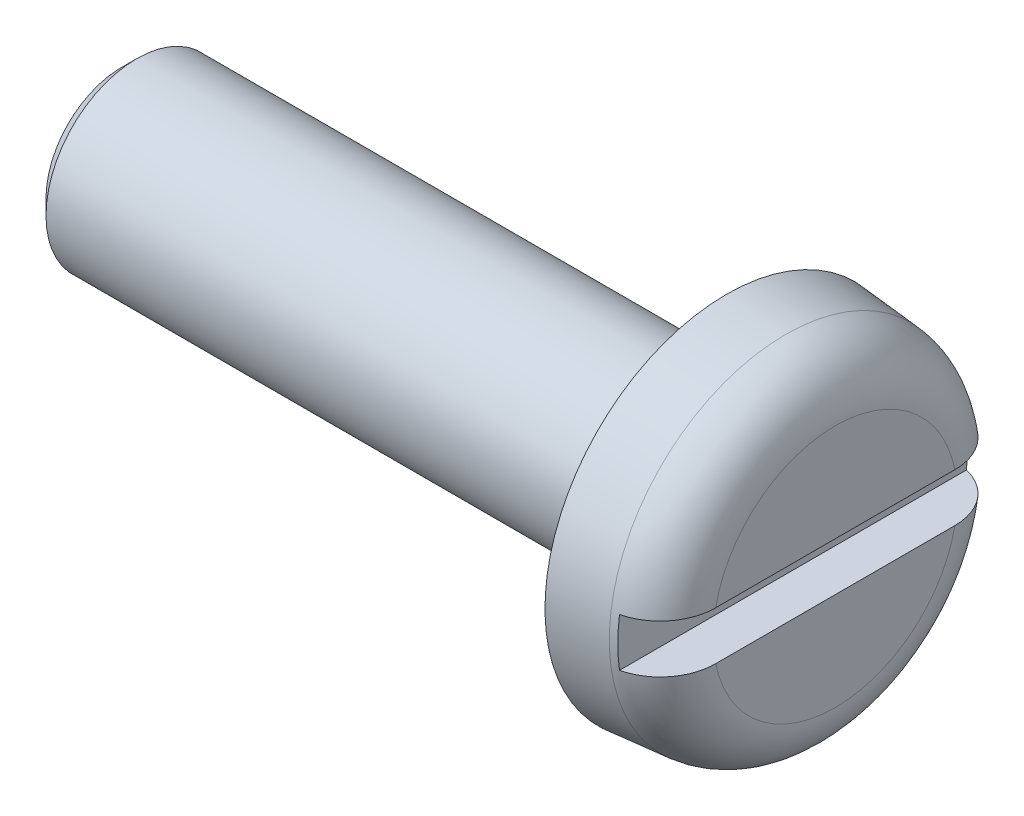
ISO-10303-21;
HEADER;
FILE_DESCRIPTION(('STEP AP214'),'2;1');
FILE_NAME('part.step','',(''),(''),'','','');
FILE_SCHEMA(('AUTOMOTIVE_DESIGN { 1 0 10303 214 1 1 1 1 }'));
ENDSEC;
DATA;
#1=APPLICATION_CONTEXT('core data for automotive mechanical design processes');
#2=APPLICATION_PROTOCOL_DEFINITION('international standard','automotive_design',2000,#1);
#3=PRODUCT_CONTEXT('',#1,'mechanical');
#4=PRODUCT('Part','Part','',(#3));
#5=PRODUCT_RELATED_PRODUCT_CATEGORY('part','',(#4));
#6=PRODUCT_DEFINITION_FORMATION('','',#4);
#7=PRODUCT_DEFINITION_CONTEXT('part definition',#1,'design');
#8=PRODUCT_DEFINITION('design','',#6,#7);
#9=PRODUCT_DEFINITION_SHAPE('','',#8);
#10=(LENGTH_UNIT() NAMED_UNIT(*) SI_UNIT(.MILLI.,.METRE.));
#11=(NAMED_UNIT(*) PLANE_ANGLE_UNIT() SI_UNIT($,.RADIAN.));
#12=(NAMED_UNIT(*) SI_UNIT($,.STERADIAN.) SOLID_ANGLE_UNIT());
#13=UNCERTAINTY_MEASURE_WITH_UNIT(LENGTH_MEASURE(1.E-05),#10,'distance_accuracy_value','');
#14=(GEOMETRIC_REPRESENTATION_CONTEXT(3) GLOBAL_UNCERTAINTY_ASSIGNED_CONTEXT((#13)) GLOBAL_UNIT_ASSIGNED_CONTEXT((#10,
#11,#12)) REPRESENTATION_CONTEXT('',''));
#15=CARTESIAN_POINT('',(0.,0.,0.));
#16=DIRECTION('',(0.,0.,1.));
#17=DIRECTION('',(1.,0.,0.));
#18=AXIS2_PLACEMENT_3D('',#15,#16,#17);
#19=CARTESIAN_POINT('',(0.,0.,0.));
#20=DIRECTION('',(1.,0.,0.));
#21=DIRECTION('',(0.,1.,0.));
#22=AXIS2_PLACEMENT_3D('',#19,#20,#21);
#23=PLANE('',#22);
#24=DIRECTION('',(0.,0.,1.));
#25=VECTOR('',#24,1.);
#26=CARTESIAN_POINT('',(0.,0.800000000000001,5.9464274989274));
#27=LINE('',#26,#25);
#28=CARTESIAN_POINT('',(0.,0.800000000000001,-3.9555566143216));
#29=VERTEX_POINT('',#28);
#30=CARTESIAN_POINT('',(0.,0.800000000000001,3.9555566143216));
#31=VERTEX_POINT('',#30);
#32=EDGE_CURVE('E89',#29,#31,#27,.T.);
#33=ORIENTED_EDGE('',*,*,#32,.F.);
#34=CARTESIAN_POINT('',(0.,0.,0.));
#35=DIRECTION('',(1.,0.,0.));
#36=DIRECTION('',(0.,1.,0.));
#37=AXIS2_PLACEMENT_3D('',#34,#35,#36);
#38=CIRCLE('',#37,4.03564469807531);
#39=EDGE_CURVE('E95',#29,#31,#38,.T.);
#40=ORIENTED_EDGE('',*,*,#39,.T.);
#41=EDGE_LOOP('',(#33,#40));
#42=FACE_BOUND('',#41,.T.);
#43=ADVANCED_FACE('F34',(#42),#23,.T.);
#44=DIRECTION('',(0.,0.,-1.));
#45=VECTOR('',#44,1.);
#46=CARTESIAN_POINT('',(0.,-0.799999999999999,5.9464274989274));
#47=LINE('',#46,#45);
#48=CARTESIAN_POINT('',(0.,-0.799999999999999,3.9555566143216));
#49=VERTEX_POINT('',#48);
#50=CARTESIAN_POINT('',(0.,-0.799999999999999,-3.9555566143216));
#51=VERTEX_POINT('',#50);
#52=EDGE_CURVE('E77',#49,#51,#47,.T.);
#53=ORIENTED_EDGE('',*,*,#52,.F.);
#54=EDGE_CURVE('E88',#49,#51,#38,.T.);
#55=ORIENTED_EDGE('',*,*,#54,.T.);
#56=EDGE_LOOP('',(#53,#55));
#57=FACE_BOUND('',#56,.T.);
#58=ADVANCED_FACE('F87',(#57),#23,.T.);
#59=CARTESIAN_POINT('',(-1.8,0.,0.));
#60=DIRECTION('',(1.,0.,0.));
#61=DIRECTION('',(0.,1.,0.));
#62=AXIS2_PLACEMENT_3D('',#59,#60,#61);
#63=TOROIDAL_SURFACE('',#62,4.03564469807531,1.8);
#64=CARTESIAN_POINT('',(-0.540762779772503,0.800000000000001,-5.2613759856627));
#65=CARTESIAN_POINT('',(-0.468002563632678,0.800000000000001,-5.18931554071322));
#66=CARTESIAN_POINT('',(-0.401331971706954,0.800000000000001,-5.11098969601856));
#67=CARTESIAN_POINT('',(-0.282092817877178,0.800000000000001,-4.94415021175995));
#68=CARTESIAN_POINT('',(-0.229543536062352,0.800000000000001,-4.85562287702027));
#69=CARTESIAN_POINT('',(-0.140058245351337,0.800000000000001,-4.67111833353568));
#70=CARTESIAN_POINT('',(-0.1031049986716,0.800000000000001,-4.57514948930957));
#71=CARTESIAN_POINT('',(-0.0456444426045708,0.800000000000001,-4.37844736615043));
#72=CARTESIAN_POINT('',(-0.0251330097273491,0.800000000000001,-4.27771528851783));
#73=CARTESIAN_POINT('',(-0.000807407176631883,0.800000000000001,-4.07306902098841));
#74=CARTESIAN_POINT('',(0.00280970089343096,0.800000000000001,-3.96913144304401));
#75=CARTESIAN_POINT('',(-0.00712688275186572,0.800000000000001,-3.76207815435695));
#76=CARTESIAN_POINT('',(-0.0206829358886565,0.800000000000001,-3.65896255860433));
#77=CARTESIAN_POINT('',(-0.0648595926784724,0.800000000000001,-3.45448287681273));
#78=CARTESIAN_POINT('',(-0.0957869506993019,0.800000000000001,-3.35318504696212));
#79=CARTESIAN_POINT('',(-0.173966954794268,0.800000000000001,-3.15709227715185));
#80=CARTESIAN_POINT('',(-0.221221562923288,0.800000000000001,-3.06229812038397));
#81=CARTESIAN_POINT('',(-0.331523815298362,0.800000000000001,-2.8805427251143));
#82=CARTESIAN_POINT('',(-0.394784707298972,0.800000000000001,-2.79371074818629));
#83=CARTESIAN_POINT('',(-0.535080660930293,0.800000000000001,-2.63196239249016));
#84=CARTESIAN_POINT('',(-0.612117058399805,0.800000000000001,-2.5570471706465));
#85=CARTESIAN_POINT('',(-0.777363260012997,0.800000000000001,-2.42207446625528));
#86=CARTESIAN_POINT('',(-0.865488934385646,0.800000000000001,-2.36191424206404));
#87=CARTESIAN_POINT('',(-1.05097305679666,0.800000000000001,-2.25807126721941));
#88=CARTESIAN_POINT('',(-1.1483280520288,0.800000000000001,-2.21438238463351));
#89=CARTESIAN_POINT('',(-1.34472607812469,0.800000000000001,-2.14709500481578));
#90=CARTESIAN_POINT('',(-1.44348146104708,0.800000000000001,-2.12265879049043));
#91=CARTESIAN_POINT('',(-1.64375523069054,0.800000000000001,-2.09184121198385));
#92=CARTESIAN_POINT('',(-1.74527230567127,0.800000000000001,-2.08545142227402));
#93=CARTESIAN_POINT('',(-1.94205144408969,0.800000000000001,-2.09089422506859));
#94=CARTESIAN_POINT('',(-2.03734311949205,0.800000000000001,-2.1017185632254));
#95=CARTESIAN_POINT('',(-2.22475371383136,0.800000000000001,-2.1391955846988));
#96=CARTESIAN_POINT('',(-2.31687240596036,0.800000000000001,-2.16584939704786));
#97=CARTESIAN_POINT('',(-2.49568716119116,0.800000000000001,-2.23389898004642));
#98=CARTESIAN_POINT('',(-2.5823713459202,0.800000000000001,-2.27532580427772));
#99=CARTESIAN_POINT('',(-2.74807422342881,0.800000000000001,-2.37138684264316));
#100=CARTESIAN_POINT('',(-2.82709115345045,0.800000000000001,-2.42602408391441));
#101=CARTESIAN_POINT('',(-2.9799165498153,0.800000000000001,-2.55022645282286));
#102=CARTESIAN_POINT('',(-3.05318434040937,0.800000000000001,-2.6204569537642));
#103=CARTESIAN_POINT('',(-3.18755425676067,0.800000000000001,-2.77172635941064));
#104=CARTESIAN_POINT('',(-3.24865355341293,0.800000000000001,-2.85276777029418));
#105=CARTESIAN_POINT('',(-3.35979277989752,0.800000000000001,-3.02754470544871));
#106=CARTESIAN_POINT('',(-3.40917690754713,0.800000000000001,-3.12169814746669));
#107=CARTESIAN_POINT('',(-3.49164209646366,0.800000000000001,-3.31689856469015));
#108=CARTESIAN_POINT('',(-3.52472176899937,0.800000000000001,-3.41794612626776));
#109=CARTESIAN_POINT('',(-3.57383047041871,0.800000000000001,-3.62528781310289));
#110=CARTESIAN_POINT('',(-3.58966846310995,0.800000000000001,-3.73162733467862));
#111=CARTESIAN_POINT('',(-3.60302482384296,0.800000000000001,-3.94545563862676));
#112=CARTESIAN_POINT('',(-3.60054405344453,0.800000000000001,-4.05294436671279));
#113=CARTESIAN_POINT('',(-3.57730809784689,0.800000000000001,-4.26456838674987));
#114=CARTESIAN_POINT('',(-3.5567824615156,0.800000000000001,-4.36872882792955));
#115=CARTESIAN_POINT('',(-3.49820144771329,0.800000000000001,-4.57200098520051));
#116=CARTESIAN_POINT('',(-3.46014775773205,0.800000000000001,-4.67111318628443));
#117=CARTESIAN_POINT('',(-3.36835841151673,0.800000000000001,-4.85952398282424));
#118=CARTESIAN_POINT('',(-3.31492535462002,0.800000000000001,-4.94897001417914));
#119=CARTESIAN_POINT('',(-3.19357222893311,0.800000000000001,-5.1174283983712));
#120=CARTESIAN_POINT('',(-3.12565341930971,0.800000000000001,-5.196441657106));
#121=CARTESIAN_POINT('',(-2.97843308341649,0.800000000000001,-5.34047951369632));
#122=CARTESIAN_POINT('',(-2.89932889793228,0.800000000000001,-5.40570586481735));
#123=CARTESIAN_POINT('',(-2.73119091898371,0.800000000000001,-5.52177624162289));
#124=CARTESIAN_POINT('',(-2.64215774589779,0.800000000000001,-5.57262116517992));
#125=CARTESIAN_POINT('',(-2.45774484574963,0.800000000000001,-5.65792437324546));
#126=CARTESIAN_POINT('',(-2.36244515719274,0.800000000000001,-5.69255575276872));
#127=CARTESIAN_POINT('',(-2.16736859982667,0.800000000000001,-5.7452167534151));
#128=CARTESIAN_POINT('',(-2.06759209093544,0.800000000000001,-5.76324770664509));
#129=CARTESIAN_POINT('',(-1.8670464863071,0.800000000000001,-5.78211504492871));
#130=CARTESIAN_POINT('',(-1.76628722683028,0.800000000000001,-5.78305617360559));
#131=CARTESIAN_POINT('',(-1.56601778316069,0.800000000000001,-5.76798048930461));
#132=CARTESIAN_POINT('',(-1.46650790933745,0.800000000000001,-5.75195954380567));
#133=CARTESIAN_POINT('',(-1.27169371218594,0.800000000000001,-5.70345798483568));
#134=CARTESIAN_POINT('',(-1.17638560748521,0.800000000000001,-5.67099251343592));
#135=CARTESIAN_POINT('',(-0.992639439872283,0.800000000000001,-5.59058259530451));
#136=CARTESIAN_POINT('',(-0.904192951568145,0.800000000000001,-5.54265751695209));
#137=CARTESIAN_POINT('',(-0.770167972453533,0.800000000000001,-5.45480755502994));
#138=CARTESIAN_POINT('',(-0.72159797671617,0.800000000000001,-5.41935523487936));
#139=CARTESIAN_POINT('',(-0.628240795352933,0.800000000000001,-5.34377955839393));
#140=CARTESIAN_POINT('',(-0.583453594173321,0.800000000000001,-5.30365622126655));
#141=CARTESIAN_POINT('',(-0.540762779772503,0.800000000000001,-5.2613759856627));
#142=B_SPLINE_CURVE_WITH_KNOTS('',3,(#64,#65,#66,#67,#68,#69,#70,#71,#72,#73,#74,#75,#76,#77,
#78,#79,#80,#81,#82,#83,#84,#85,#86,#87,#88,#89,#90,#91,#92,#93,#94,#95,#96,#97,#98,#99,#100,
#101,#102,#103,#104,#105,#106,#107,#108,#109,#110,#111,#112,#113,#114,#115,#116,#117,#118,#119,
#120,#121,#122,#123,#124,#125,#126,#127,#128,#129,#130,#131,#132,#133,#134,#135,#136,#137,#138,
#139,#140,#141),.UNSPECIFIED.,.T.,.F.,(4,2,2,2,2,2,2,2,2,2,2,2,2,2,2,2,2,2,2,2,2,2,2,2,2,2,2,2,
2,2,2,2,2,2,2,2,2,2,4),(0.,0.306991422181551,0.614399880160629,0.921467674223051,
1.22845843375204,1.53902124968411,1.84962677466023,2.1658978762407,2.48220699752465,
2.80297521633035,3.12377455756811,3.4422723020991,3.76065135929225,4.06426589424078,
4.36773865394976,4.65408102504908,4.94044382188495,5.22741215014114,5.51444629896418,
5.81757894484908,6.12078198527096,6.43825439592393,6.75575384260397,7.07673643314107,
7.39770392746607,7.71464653140136,8.0315586284897,8.34261788306675,8.65365010998578,
8.95975564746201,9.2658420696977,9.56858170023437,9.87129703520848,10.1721563958159,
10.4730890725641,10.7737451537516,11.0740260151275,11.254148730699,11.4342707056229),.UNSPECIFIED.);
#143=CARTESIAN_POINT('',(-1.4,0.800000000000001,-5.73510972270059));
#144=VERTEX_POINT('',#143);
#145=EDGE_CURVE('E127',#144,#29,#142,.T.);
#146=ORIENTED_EDGE('',*,*,#145,.F.);
#147=CARTESIAN_POINT('',(-1.4,0.,0.));
#148=DIRECTION('',(1.,0.,0.));
#149=DIRECTION('',(0.,1.,0.));
#150=AXIS2_PLACEMENT_3D('',#147,#148,#149);
#151=CIRCLE('',#150,5.79063757555374);
#152=CARTESIAN_POINT('',(-1.4,-0.8,-5.73510972270059));
#153=VERTEX_POINT('',#152);
#154=EDGE_CURVE('E98',#144,#153,#151,.F.);
#155=ORIENTED_EDGE('',*,*,#154,.T.);
#156=CARTESIAN_POINT('',(-0.540762779772502,-0.799999999999999,-5.2613759856627));
#157=CARTESIAN_POINT('',(-0.612348267833112,-0.799999999999999,-5.33226007170116));
#158=CARTESIAN_POINT('',(-0.689931624483256,-0.799999999999999,-5.3971854360864));
#159=CARTESIAN_POINT('',(-0.854947480958874,-0.799999999999999,-5.51316161419667));
#160=CARTESIAN_POINT('',(-0.942390684039739,-0.8,-5.56419714083425));
#161=CARTESIAN_POINT('',(-1.12461220777288,-0.8,-5.650821698781));
#162=CARTESIAN_POINT('',(-1.2193891749519,-0.8,-5.6864135722998));
#163=CARTESIAN_POINT('',(-1.41356630869313,-0.8,-5.74109194486802));
#164=CARTESIAN_POINT('',(-1.51296538612706,-0.8,-5.76018231167996));
#165=CARTESIAN_POINT('',(-1.71313899884107,-0.8,-5.78126121010733));
#166=CARTESIAN_POINT('',(-1.81390602781744,-0.8,-5.78332104849312));
#167=CARTESIAN_POINT('',(-2.01435310870812,-0.8,-5.77046455591491));
#168=CARTESIAN_POINT('',(-2.11403314136679,-0.8,-5.75554792471215));
#169=CARTESIAN_POINT('',(-2.309314019599,-0.8,-5.70921606698696));
#170=CARTESIAN_POINT('',(-2.40492104285082,-0.8,-5.67782686375404));
#171=CARTESIAN_POINT('',(-2.58952927366997,-0.8,-5.59948776999251));
#172=CARTESIAN_POINT('',(-2.67853045965259,-0.8,-5.55253782862158));
#173=CARTESIAN_POINT('',(-2.84769451709795,-0.8,-5.44428887284169));
#174=CARTESIAN_POINT('',(-2.92783091190503,-0.8,-5.38294849495739));
#175=CARTESIAN_POINT('',(-3.07676159380061,-0.8,-5.24777626794688));
#176=CARTESIAN_POINT('',(-3.1455556000378,-0.8,-5.17394410960072));
#177=CARTESIAN_POINT('',(-3.27042510006679,-0.8,-5.01531035004638));
#178=CARTESIAN_POINT('',(-3.32640120093555,-0.8,-4.93043053468211));
#179=CARTESIAN_POINT('',(-3.4235057335277,-0.8,-4.75256933107916));
#180=CARTESIAN_POINT('',(-3.46463341173424,-0.8,-4.65958753198411));
#181=CARTESIAN_POINT('',(-3.53144158740719,-0.8,-4.46694835930406));
#182=CARTESIAN_POINT('',(-3.55692557695194,-0.8,-4.36722286731019));
#183=CARTESIAN_POINT('',(-3.59108701240466,-0.8,-4.16493761370543));
#184=CARTESIAN_POINT('',(-3.59976314730697,-0.8,-4.06237763163826));
#185=CARTESIAN_POINT('',(-3.60023112204594,-0.8,-3.85550711797727));
#186=CARTESIAN_POINT('',(-3.59173848020812,-0.8,-3.75119596435576));
#187=CARTESIAN_POINT('',(-3.55768438775145,-0.8,-3.54539907321037));
#188=CARTESIAN_POINT('',(-3.53212117001275,-0.8,-3.44391362933273));
#189=CARTESIAN_POINT('',(-3.4641232265762,-0.8,-3.24471369522716));
#190=CARTESIAN_POINT('',(-3.42139292448942,-0.8,-3.14710004339202));
#191=CARTESIAN_POINT('',(-3.32030286126869,-0.8,-2.96031799684206));
#192=CARTESIAN_POINT('',(-3.26194098746564,-0.8,-2.87115074589868));
#193=CARTESIAN_POINT('',(-3.13053846590042,-0.8,-2.70303664476894));
#194=CARTESIAN_POINT('',(-3.05736818947569,-0.8,-2.62419095430027));
#195=CARTESIAN_POINT('',(-2.89859048019691,-0.8,-2.48017518003935));
#196=CARTESIAN_POINT('',(-2.81298317052277,-0.8,-2.41500496081701));
#197=CARTESIAN_POINT('',(-2.6334271917975,-0.8,-2.30187272884191));
#198=CARTESIAN_POINT('',(-2.53967929429022,-0.8,-2.25359299068592));
#199=CARTESIAN_POINT('',(-2.34507363608623,-0.8,-2.17455467657048));
#200=CARTESIAN_POINT('',(-2.24421969391145,-0.8,-2.14378676989656));
#201=CARTESIAN_POINT('',(-2.04443930043831,-0.8,-2.10254396085451));
#202=CARTESIAN_POINT('',(-1.94573097864464,-0.8,-2.09101175757253));
#203=CARTESIAN_POINT('',(-1.74783816921245,-0.8,-2.08550669067498));
#204=CARTESIAN_POINT('',(-1.64865381611907,-0.8,-2.09152912719204));
#205=CARTESIAN_POINT('',(-1.45702700128851,-0.8,-2.12018138669895));
#206=CARTESIAN_POINT('',(-1.36447664311325,-0.8,-2.14209986414969));
#207=CARTESIAN_POINT('',(-1.18420660887441,-0.8,-2.20075771988038));
#208=CARTESIAN_POINT('',(-1.09648771677086,-0.8,-2.23749949540336));
#209=CARTESIAN_POINT('',(-0.925723712262196,-0.8,-2.32557805989792));
#210=CARTESIAN_POINT('',(-0.842868129539057,-0.799999999999999,-2.37728131212897));
#211=CARTESIAN_POINT('',(-0.686362373553196,-0.799999999999999,-2.493116771694));
#212=CARTESIAN_POINT('',(-0.612714484293672,-0.799999999999999,-2.55725205281721));
#213=CARTESIAN_POINT('',(-0.472161131150061,-0.799999999999999,-2.70027682193658));
#214=CARTESIAN_POINT('',(-0.405916890621632,-0.799999999999999,-2.77981681647101));
#215=CARTESIAN_POINT('',(-0.287173334850297,-0.799999999999999,-2.9485732644704));
#216=CARTESIAN_POINT('',(-0.234676689699709,-0.799999999999999,-3.03779159293386));
#217=CARTESIAN_POINT('',(-0.143214450603963,-0.799999999999999,-3.22677844667971));
#218=CARTESIAN_POINT('',(-0.104782434188803,-0.799999999999999,-3.32680584966186));
#219=CARTESIAN_POINT('',(-0.0452446811445116,-0.799999999999999,-3.5318922427284));
#220=CARTESIAN_POINT('',(-0.0241387825809872,-0.799999999999999,-3.63695118577701));
#221=CARTESIAN_POINT('',(1.12670491668143E-05,-0.799999999999999,-3.84916824961405));
#222=CARTESIAN_POINT('',(0.00304965106473683,-0.799999999999999,-3.95632702970971));
#223=CARTESIAN_POINT('',(-0.00921984656727694,-0.799999999999999,-4.1696231990436));
#224=CARTESIAN_POINT('',(-0.0245310191193001,-0.799999999999999,-4.27576040162512));
#225=CARTESIAN_POINT('',(-0.0728327354457022,-0.799999999999999,-4.48216521024852));
#226=CARTESIAN_POINT('',(-0.105541716926033,-0.799999999999999,-4.58249883820926));
#227=CARTESIAN_POINT('',(-0.187634706209927,-0.799999999999999,-4.77599767564169));
#228=CARTESIAN_POINT('',(-0.236996530319204,-0.799999999999999,-4.86917222023919));
#229=CARTESIAN_POINT('',(-0.329466421611779,-0.799999999999999,-5.01228034019194));
#230=CARTESIAN_POINT('',(-0.367921794022496,-0.799999999999999,-5.06527765273015));
#231=CARTESIAN_POINT('',(-0.450329512489137,-0.799999999999999,-5.16681267030748));
#232=CARTESIAN_POINT('',(-0.494281795276484,-0.799999999999999,-5.21535042666423));
#233=CARTESIAN_POINT('',(-0.540762779772502,-0.799999999999999,-5.2613759856627));
#234=B_SPLINE_CURVE_WITH_KNOTS('',3,(#156,#157,#158,#159,#160,#161,#162,#163,#164,#165,#166,
#167,#168,#169,#170,#171,#172,#173,#174,#175,#176,#177,#178,#179,#180,#181,#182,#183,#184,#185,
#186,#187,#188,#189,#190,#191,#192,#193,#194,#195,#196,#197,#198,#199,#200,#201,#202,#203,#204,
#205,#206,#207,#208,#209,#210,#211,#212,#213,#214,#215,#216,#217,#218,#219,#220,#221,#222,#223,
#224,#225,#226,#227,#228,#229,#230,#231,#232,#233),.UNSPECIFIED.,.T.,.F.,(4,2,2,2,2,2,2,2,2,2,2,
2,2,2,2,2,2,2,2,2,2,2,2,2,2,2,2,2,2,2,2,2,2,2,2,2,2,2,4),(0.,0.301990665553572,
0.604312368689127,0.906578409704399,1.20877358382585,1.50970282356458,1.81063738549513,
2.11109795731507,2.41155951085344,2.71289551957028,3.01423898861248,3.31784547930252,
3.6214673750267,3.92882908454075,4.23621476717483,4.54873547778502,4.86128854507609,
5.17947093252907,5.49769634531691,5.81883829248559,6.13997705919035,6.45470120134885,
6.76925749373849,7.06587349636817,7.36241009390429,7.64643650558142,7.93050886880334,
8.22223277783168,8.51402890710833,8.8231740529347,9.13237919724671,9.45232886972293,
9.77227555183242,10.0923243536798,10.4124305633264,10.7275071903339,11.042165741933,
11.2382527614178,11.4343375241794),.UNSPECIFIED.);
#235=EDGE_CURVE('E57',#51,#153,#234,.T.);
#236=ORIENTED_EDGE('',*,*,#235,.F.);
#237=ORIENTED_EDGE('',*,*,#54,.F.);
#238=CARTESIAN_POINT('',(-0.836266142673704,-0.799999999999999,2.38476753441919));
#239=CARTESIAN_POINT('',(-0.917616920395549,-0.799999999999999,2.33037611985148));
#240=CARTESIAN_POINT('',(-1.00338812809191,-0.8,2.28250940898636));
#241=CARTESIAN_POINT('',(-1.18171371257086,-0.8,2.20157945647336));
#242=CARTESIAN_POINT('',(-1.27427138419532,-0.8,2.16852346158101));
#243=CARTESIAN_POINT('',(-1.46387360375784,-0.8,2.11861651463578));
#244=CARTESIAN_POINT('',(-1.56092620726988,-0.8,2.10179593736475));
#245=CARTESIAN_POINT('',(-1.75645828986596,-0.8,2.08531619913094));
#246=CARTESIAN_POINT('',(-1.85493729786073,-0.8,2.08565149582934));
#247=CARTESIAN_POINT('',(-2.04724581885373,-0.8,2.10316628821439));
#248=CARTESIAN_POINT('',(-2.1411242466631,-0.8,2.11981673272017));
#249=CARTESIAN_POINT('',(-2.32483197664105,-0.8,2.16840533825103));
#250=CARTESIAN_POINT('',(-2.41466058319104,-0.8,2.20034611475993));
#251=CARTESIAN_POINT('',(-2.58937479658255,-0.8,2.27883470838468));
#252=CARTESIAN_POINT('',(-2.67416016608233,-0.8,2.32560484151197));
#253=CARTESIAN_POINT('',(-2.83527159661578,-0.8,2.43194790875205));
#254=CARTESIAN_POINT('',(-2.91159566808817,-0.8,2.4915238443409));
#255=CARTESIAN_POINT('',(-3.05833847206813,-0.8,2.62557742394097));
#256=CARTESIAN_POINT('',(-3.12814463920814,-0.8,2.70072607421442));
#257=CARTESIAN_POINT('',(-3.25476371599267,-0.8,2.86127427469928));
#258=CARTESIAN_POINT('',(-3.31157384747778,-0.8,2.94667601077194));
#259=CARTESIAN_POINT('',(-3.41282909605205,-0.8,3.12914373500798));
#260=CARTESIAN_POINT('',(-3.4566732787476,-0.8,3.22654397769993));
#261=CARTESIAN_POINT('',(-3.52749042959911,-0.8,3.42730182448779));
#262=CARTESIAN_POINT('',(-3.55446245509905,-0.8,3.53065976109082));
#263=CARTESIAN_POINT('',(-3.59074777581197,-0.8,3.74099682308468));
#264=CARTESIAN_POINT('',(-3.59996828480699,-0.8,3.84799201669904));
#265=CARTESIAN_POINT('',(-3.60003154521387,-0.8,4.06199242805616));
#266=CARTESIAN_POINT('',(-3.59087543963191,-0.8,4.16899764476154));
#267=CARTESIAN_POINT('',(-3.5545508836994,-0.8,4.37828946953499));
#268=CARTESIAN_POINT('',(-3.5276490501339,-0.8,4.48062230606524));
#269=CARTESIAN_POINT('',(-3.45672417667962,-0.8,4.67917518429467));
#270=CARTESIAN_POINT('',(-3.41270279239386,-0.8,4.77539581604843));
#271=CARTESIAN_POINT('',(-3.30967441571423,-0.8,4.95711293936014));
#272=CARTESIAN_POINT('',(-3.2509575917222,-0.8,5.04277397494753));
#273=CARTESIAN_POINT('',(-3.11977209379603,-0.8,5.20282644762344));
#274=CARTESIAN_POINT('',(-3.04730458946901,-0.8,5.27721884223437));
#275=CARTESIAN_POINT('',(-2.89186263836087,-0.8,5.41145672931944));
#276=CARTESIAN_POINT('',(-2.80906226498413,-0.8,5.47150384635816));
#277=CARTESIAN_POINT('',(-2.63447307414862,-0.8,5.57667826647956));
#278=CARTESIAN_POINT('',(-2.54268479385402,-0.8,5.62180646049025));
#279=CARTESIAN_POINT('',(-2.35372245855627,-0.8,5.69541178601739));
#280=CARTESIAN_POINT('',(-2.25661170214885,-0.8,5.72405148642268));
#281=CARTESIAN_POINT('',(-2.05894963569563,-0.8,5.76452632903134));
#282=CARTESIAN_POINT('',(-1.95839844559039,-0.8,5.77636205644549));
#283=CARTESIAN_POINT('',(-1.75726466993558,-0.8,5.78286013265482));
#284=CARTESIAN_POINT('',(-1.65668492734368,-0.8,5.77761084028505));
#285=CARTESIAN_POINT('',(-1.45783846372769,-0.8,5.75028865632157));
#286=CARTESIAN_POINT('',(-1.35957171560434,-0.8,5.72821596193375));
#287=CARTESIAN_POINT('',(-1.16819371267695,-0.8,5.66791633540255));
#288=CARTESIAN_POINT('',(-1.07507939389964,-0.8,5.62969912319174));
#289=CARTESIAN_POINT('',(-0.896555358732773,-0.8,5.53823241598758));
#290=CARTESIAN_POINT('',(-0.811145708608114,-0.799999999999999,5.48498279172249));
#291=CARTESIAN_POINT('',(-0.650082876219721,-0.799999999999999,5.36476593037792));
#292=CARTESIAN_POINT('',(-0.574468804826388,-0.799999999999999,5.29774630893073));
#293=CARTESIAN_POINT('',(-0.435451535945253,-0.799999999999999,5.15205983914348));
#294=CARTESIAN_POINT('',(-0.372048731656855,-0.799999999999999,5.07339261589811));
#295=CARTESIAN_POINT('',(-0.258650816330334,-0.799999999999999,4.90594446263168));
#296=CARTESIAN_POINT('',(-0.208774635933076,-0.799999999999999,4.8170830169983));
#297=CARTESIAN_POINT('',(-0.124428147888648,-0.799999999999999,4.63233098726459));
#298=CARTESIAN_POINT('',(-0.0899587510920711,-0.799999999999999,4.53643998796633));
#299=CARTESIAN_POINT('',(-0.0368868820421763,-0.799999999999999,4.33899079972006));
#300=CARTESIAN_POINT('',(-0.0185025255877259,-0.799999999999999,4.23737401613092));
#301=CARTESIAN_POINT('',(0.0012573479908821,-0.799999999999999,4.03250747712129));
#302=CARTESIAN_POINT('',(0.00263209949744791,-0.799999999999999,3.9292576484054));
#303=CARTESIAN_POINT('',(-0.0116307665412087,-0.799999999999999,3.72214563494947));
#304=CARTESIAN_POINT('',(-0.0275632061751758,-0.799999999999999,3.61830377486543));
#305=CARTESIAN_POINT('',(-0.076333596788761,-0.799999999999999,3.41464106293113));
#306=CARTESIAN_POINT('',(-0.109177249679509,-0.799999999999999,3.31482157954313));
#307=CARTESIAN_POINT('',(-0.191511099721981,-0.799999999999999,3.12021092040486));
#308=CARTESIAN_POINT('',(-0.241286347194323,-0.799999999999999,3.02554040328379));
#309=CARTESIAN_POINT('',(-0.355915618814842,-0.799999999999999,2.8458978279608));
#310=CARTESIAN_POINT('',(-0.420755571218364,-0.799999999999999,2.76091682866338));
#311=CARTESIAN_POINT('',(-0.543269993526276,-0.799999999999999,2.62572980615078));
#312=CARTESIAN_POINT('',(-0.597683333164854,-0.799999999999999,2.57253239665292));
#313=CARTESIAN_POINT('',(-0.712598229155983,-0.799999999999999,2.4731680246369));
#314=CARTESIAN_POINT('',(-0.773099631725334,-0.799999999999999,2.4270008846096));
#315=CARTESIAN_POINT('',(-0.836266142673704,-0.799999999999999,2.38476753441919));
#316=B_SPLINE_CURVE_WITH_KNOTS('',3,(#238,#239,#240,#241,#242,#243,#244,#245,#246,#247,#248,
#249,#250,#251,#252,#253,#254,#255,#256,#257,#258,#259,#260,#261,#262,#263,#264,#265,#266,#267,
#268,#269,#270,#271,#272,#273,#274,#275,#276,#277,#278,#279,#280,#281,#282,#283,#284,#285,#286,
#287,#288,#289,#290,#291,#292,#293,#294,#295,#296,#297,#298,#299,#300,#301,#302,#303,#304,#305,
#306,#307,#308,#309,#310,#311,#312,#313,#314,#315),.UNSPECIFIED.,.T.,.F.,(4,2,2,2,2,2,2,2,2,2,2,
2,2,2,2,2,2,2,2,2,2,2,2,2,2,2,2,2,2,2,2,2,2,2,2,2,2,2,4),(0.,0.293321979457734,
0.586787322516146,0.880800650631159,1.17471899604829,1.45941156882231,1.74415285702185,
2.03338255615662,2.32268012018922,2.62901646924018,2.93541824267213,3.25435495988079,
3.57330949465531,3.89392670887913,4.21452398166584,4.53041098625831,4.84626744954257,
5.15632110717719,5.46634840404057,5.77172128030291,6.07707591701729,6.37936593322563,
6.6816454217023,6.98236409614661,7.2830792455858,7.5836136045785,7.88415054810524,
8.18585270916065,8.48756458331813,8.79184901385485,9.09615143133901,9.40451898940015,
9.71290042731147,10.0266186112637,10.3404426401165,10.6598354635326,10.9789311372724,
11.2066928680963,11.43444884715),.UNSPECIFIED.);
#317=CARTESIAN_POINT('',(-1.4,-0.8,5.73510972270059));
#318=VERTEX_POINT('',#317);
#319=EDGE_CURVE('E74',#318,#49,#316,.T.);
#320=ORIENTED_EDGE('',*,*,#319,.F.);
#321=CARTESIAN_POINT('',(-1.4,0.800000000000001,5.73510972270059));
#322=VERTEX_POINT('',#321);
#323=EDGE_CURVE('E83',#318,#322,#151,.F.);
#324=ORIENTED_EDGE('',*,*,#323,.T.);
#325=CARTESIAN_POINT('',(-0.836266142673704,0.800000000000001,2.38476753441919));
#326=CARTESIAN_POINT('',(-0.748506893430262,0.800000000000001,2.44345191414655));
#327=CARTESIAN_POINT('',(-0.665766647879348,0.800000000000001,2.50981960320106));
#328=CARTESIAN_POINT('',(-0.51255125636554,0.800000000000001,2.65561376218173));
#329=CARTESIAN_POINT('',(-0.442099246823711,0.800000000000001,2.73506432962604));
#330=CARTESIAN_POINT('',(-0.315475262434064,0.800000000000001,2.90443495121528));
#331=CARTESIAN_POINT('',(-0.259280268430428,0.800000000000001,2.99433778254075));
#332=CARTESIAN_POINT('',(-0.162548938959551,0.800000000000001,3.18215299216268));
#333=CARTESIAN_POINT('',(-0.122006089879258,0.800000000000001,3.28006201809487));
#334=CARTESIAN_POINT('',(-0.0572425021539002,0.800000000000001,3.4827212450359));
#335=CARTESIAN_POINT('',(-0.0332676369124976,0.800000000000001,3.58755021276299));
#336=CARTESIAN_POINT('',(-0.00342578696207457,0.800000000000001,3.79976969875038));
#337=CARTESIAN_POINT('',(0.00244009682357935,0.800000000000001,3.90716037234792));
#338=CARTESIAN_POINT('',(-0.00425089062541499,0.800000000000001,4.12040369131769));
#339=CARTESIAN_POINT('',(-0.0166422393499393,0.800000000000001,4.22626147612868));
#340=CARTESIAN_POINT('',(-0.0593599277228405,0.800000000000001,4.43429705562788));
#341=CARTESIAN_POINT('',(-0.0896844898843736,0.800000000000001,4.53647521396505));
#342=CARTESIAN_POINT('',(-0.166811113143519,0.800000000000001,4.73226366726685));
#343=CARTESIAN_POINT('',(-0.21330327024463,0.800000000000001,4.82599604324917));
#344=CARTESIAN_POINT('',(-0.32162267572296,0.800000000000001,5.00413844404781));
#345=CARTESIAN_POINT('',(-0.383448471720296,0.800000000000001,5.08854935068632));
#346=CARTESIAN_POINT('',(-0.519544306999232,0.800000000000001,5.24416143149033));
#347=CARTESIAN_POINT('',(-0.593588166123753,0.800000000000001,5.31556046719266));
#348=CARTESIAN_POINT('',(-0.75273955583597,0.800000000000001,5.44472836027191));
#349=CARTESIAN_POINT('',(-0.837846323514924,0.800000000000001,5.5024981567616));
#350=CARTESIAN_POINT('',(-1.01558854842572,0.800000000000001,5.60205300956143));
#351=CARTESIAN_POINT('',(-1.10812041731753,0.8,5.64402306987624));
#352=CARTESIAN_POINT('',(-1.29895009056469,0.8,5.71170590778668));
#353=CARTESIAN_POINT('',(-1.39724763350181,0.8,5.7374194218397));
#354=CARTESIAN_POINT('',(-1.59606633976361,0.8,5.77169733961628));
#355=CARTESIAN_POINT('',(-1.69656671478609,0.8,5.78038241634162));
#356=CARTESIAN_POINT('',(-1.89759433538528,0.8,5.78071120137491));
#357=CARTESIAN_POINT('',(-1.99812158035831,0.8,5.77235526485593));
#358=CARTESIAN_POINT('',(-2.19609344292374,0.8,5.73889133318644));
#359=CARTESIAN_POINT('',(-2.29354498303738,0.8,5.71382425898093));
#360=CARTESIAN_POINT('',(-2.48286854703151,0.8,5.64771711956062));
#361=CARTESIAN_POINT('',(-2.57474056774009,0.8,5.60667704526538));
#362=CARTESIAN_POINT('',(-2.75051258087327,0.8,5.50972539102507));
#363=CARTESIAN_POINT('',(-2.8343959465404,0.8,5.45378367661804));
#364=CARTESIAN_POINT('',(-2.99165678299636,0.8,5.32869697027017));
#365=CARTESIAN_POINT('',(-3.06503402042885,0.8,5.25955168513844));
#366=CARTESIAN_POINT('',(-3.19973989676036,0.8,5.10955333442706));
#367=CARTESIAN_POINT('',(-3.26098586193471,0.8,5.02862604540654));
#368=CARTESIAN_POINT('',(-3.36919753390679,0.8,4.85773374858047));
#369=CARTESIAN_POINT('',(-3.41616259992529,0.8,4.76776833547817));
#370=CARTESIAN_POINT('',(-3.49507738631938,0.8,4.5802716594319));
#371=CARTESIAN_POINT('',(-3.52685014697164,0.8,4.48266594703615));
#372=CARTESIAN_POINT('',(-3.57383908213109,0.8,4.28355151356638));
#373=CARTESIAN_POINT('',(-3.58905405146405,0.8,4.18204250894425));
#374=CARTESIAN_POINT('',(-3.60277332841501,0.8,3.97627512738235));
#375=CARTESIAN_POINT('',(-3.60100695654502,0.8,3.87199872990389));
#376=CARTESIAN_POINT('',(-3.58032198396241,0.8,3.66516328359259));
#377=CARTESIAN_POINT('',(-3.56140169370222,0.8,3.56260440493742));
#378=CARTESIAN_POINT('',(-3.50655445326333,0.8,3.3601262182977));
#379=CARTESIAN_POINT('',(-3.47032341934756,0.8,3.26028924640596));
#380=CARTESIAN_POINT('',(-3.38182060870726,0.8,3.06798854276054));
#381=CARTESIAN_POINT('',(-3.32954675396352,0.8,2.97552576813911));
#382=CARTESIAN_POINT('',(-3.20964725567174,0.8,2.79948120171889));
#383=CARTESIAN_POINT('',(-3.14184223712501,0.800000000000001,2.71602141217628));
#384=CARTESIAN_POINT('',(-2.99302219632622,0.800000000000001,2.56181483592421));
#385=CARTESIAN_POINT('',(-2.91200632330115,0.800000000000001,2.49106886859632));
#386=CARTESIAN_POINT('',(-2.73997760711788,0.800000000000001,2.36551639760888));
#387=CARTESIAN_POINT('',(-2.64910309983349,0.800000000000001,2.31052086250488));
#388=CARTESIAN_POINT('',(-2.4590409075158,0.800000000000001,2.21753014012797));
#389=CARTESIAN_POINT('',(-2.35985743984191,0.800000000000001,2.17952638970964));
#390=CARTESIAN_POINT('',(-2.16147923078881,0.800000000000001,2.12383562208936));
#391=CARTESIAN_POINT('',(-2.06255196747457,0.800000000000001,2.10519696055357));
#392=CARTESIAN_POINT('',(-1.86294330184555,0.800000000000001,2.08580594361597));
#393=CARTESIAN_POINT('',(-1.76226208748034,0.800000000000001,2.08505168341593));
#394=CARTESIAN_POINT('',(-1.56749167167987,0.800000000000001,2.1010369991765));
#395=CARTESIAN_POINT('',(-1.47332742294699,0.800000000000001,2.11688981083895));
#396=CARTESIAN_POINT('',(-1.28901868791397,0.800000000000001,2.16397488361137));
#397=CARTESIAN_POINT('',(-1.19886974388066,0.800000000000001,2.19518960135132));
#398=CARTESIAN_POINT('',(-1.0638315376683,0.800000000000001,2.25452352584505));
#399=CARTESIAN_POINT('',(-1.01673933731484,0.800000000000001,2.27777851827376));
#400=CARTESIAN_POINT('',(-0.924773358306768,0.800000000000001,2.32831196324339));
#401=CARTESIAN_POINT('',(-0.879899400191996,0.800000000000001,2.35559008959122));
#402=CARTESIAN_POINT('',(-0.836266142673704,0.800000000000001,2.38476753441919));
#403=B_SPLINE_CURVE_WITH_KNOTS('',3,(#325,#326,#327,#328,#329,#330,#331,#332,#333,#334,#335,
#336,#337,#338,#339,#340,#341,#342,#343,#344,#345,#346,#347,#348,#349,#350,#351,#352,#353,#354,
#355,#356,#357,#358,#359,#360,#361,#362,#363,#364,#365,#366,#367,#368,#369,#370,#371,#372,#373,
#374,#375,#376,#377,#378,#379,#380,#381,#382,#383,#384,#385,#386,#387,#388,#389,#390,#391,#392,
#393,#394,#395,#396,#397,#398,#399,#400,#401,#402),.UNSPECIFIED.,.T.,.F.,(4,2,2,2,2,2,2,2,2,2,2,
2,2,2,2,2,2,2,2,2,2,2,2,2,2,2,2,2,2,2,2,2,2,2,2,2,2,2,4),(0.,0.316518163802675,
0.633625985041104,0.950218502983176,1.2666791291138,1.58774070740088,1.90882180402668,
2.22700979028291,2.54516624397578,2.8575328146744,3.16986980975956,3.47696670296019,
3.78404242968966,4.08740155648282,4.39074693945368,4.691934764996,4.99311631317029,
5.29356304698593,5.59400995160177,5.89506910144275,6.19613493720729,6.49918680513005,
6.80225226888417,7.10876667239494,7.41530338434966,7.72673423590704,8.03819576467738,
8.35534173040458,8.6725287932536,8.99358246518054,9.31465682098899,9.63169865945436,
9.94858054156722,10.2490245150223,10.549436489211,10.8345871229657,11.1194128663603,
11.276796138315,11.4341666567444),.UNSPECIFIED.);
#404=EDGE_CURVE('E82',#31,#322,#403,.T.);
#405=ORIENTED_EDGE('',*,*,#404,.F.);
#406=ORIENTED_EDGE('',*,*,#39,.F.);
#407=EDGE_LOOP('',(#146,#155,#236,#237,#320,#324,#405,#406));
#408=FACE_BOUND('',#407,.T.);
#409=CARTESIAN_POINT('',(-1.64311966305421,0.,0.));
#410=DIRECTION('',(1.,0.,0.));
#411=DIRECTION('',(0.,1.,0.));
#412=AXIS2_PLACEMENT_3D('',#409,#410,#411);
#413=CIRCLE('',#412,5.82879515464045);
#414=CARTESIAN_POINT('',(-1.64311966305421,5.82879515464045,0.));
#415=VERTEX_POINT('',#414);
#416=EDGE_CURVE('E100',#415,#415,#413,.T.);
#417=ORIENTED_EDGE('',*,*,#416,.T.);
#418=EDGE_LOOP('',(#417));
#419=FACE_BOUND('',#418,.T.);
#420=ADVANCED_FACE('F92',(#408,#419),#63,.T.);
#421=CARTESIAN_POINT('',(-1.64311966305421,0.,0.));
#422=DIRECTION('',(-1.,0.,0.));
#423=DIRECTION('',(0.,-1.,0.));
#424=AXIS2_PLACEMENT_3D('',#421,#422,#423);
#425=CONICAL_SURFACE('',#424,5.82879515464045,0.0872664625997173);
#426=CARTESIAN_POINT('',(-3.6,0.,0.));
#427=DIRECTION('',(1.,0.,0.));
#428=DIRECTION('',(0.,1.,0.));
#429=AXIS2_PLACEMENT_3D('',#426,#427,#428);
#430=CIRCLE('',#429,6.);
#431=CARTESIAN_POINT('',(-3.6,6.,0.));
#432=VERTEX_POINT('',#431);
#433=EDGE_CURVE('E155',#432,#432,#430,.T.);
#434=ORIENTED_EDGE('',*,*,#433,.T.);
#435=EDGE_LOOP('',(#434));
#436=FACE_BOUND('',#435,.T.);
#437=ORIENTED_EDGE('',*,*,#416,.F.);
#438=EDGE_LOOP('',(#437));
#439=FACE_BOUND('',#438,.T.);
#440=ADVANCED_FACE('F164',(#436,#439),#425,.T.);
#441=CARTESIAN_POINT('',(-3.6,6.,0.));
#442=DIRECTION('',(-1.,0.,0.));
#443=DIRECTION('',(0.,-1.,0.));
#444=AXIS2_PLACEMENT_3D('',#441,#442,#443);
#445=PLANE('',#444);
#446=CARTESIAN_POINT('',(-3.6,0.,0.));
#447=DIRECTION('',(1.,0.,0.));
#448=DIRECTION('',(0.,1.,0.));
#449=AXIS2_PLACEMENT_3D('',#446,#447,#448);
#450=CIRCLE('',#449,3.);
#451=CARTESIAN_POINT('',(-3.6,3.,0.));
#452=VERTEX_POINT('',#451);
#453=EDGE_CURVE('E152',#452,#452,#450,.T.);
#454=ORIENTED_EDGE('',*,*,#453,.T.);
#455=EDGE_LOOP('',(#454));
#456=FACE_BOUND('',#455,.T.);
#457=ORIENTED_EDGE('',*,*,#433,.F.);
#458=EDGE_LOOP('',(#457));
#459=FACE_BOUND('',#458,.T.);
#460=ADVANCED_FACE('F166',(#456,#459),#445,.T.);
#461=CARTESIAN_POINT('',(0.,0.,0.));
#462=DIRECTION('',(1.,0.,0.));
#463=DIRECTION('',(0.,1.,0.));
#464=AXIS2_PLACEMENT_3D('',#461,#462,#463);
#465=CYLINDRICAL_SURFACE('',#464,3.);
#466=CARTESIAN_POINT('',(-23.1,0.,0.));
#467=DIRECTION('',(-1.,0.,0.));
#468=DIRECTION('',(0.,-1.,0.));
#469=AXIS2_PLACEMENT_3D('',#466,#467,#468);
#470=CIRCLE('',#469,3.);
#471=CARTESIAN_POINT('',(-23.1,-3.,0.));
#472=VERTEX_POINT('',#471);
#473=EDGE_CURVE('E42',#472,#472,#470,.F.);
#474=ORIENTED_EDGE('',*,*,#473,.T.);
#475=EDGE_LOOP('',(#474));
#476=FACE_BOUND('',#475,.T.);
#477=ORIENTED_EDGE('',*,*,#453,.F.);
#478=EDGE_LOOP('',(#477));
#479=FACE_BOUND('',#478,.T.);
#480=ADVANCED_FACE('F133',(#476,#479),#465,.T.);
#481=CARTESIAN_POINT('',(-23.6,3.,0.));
#482=DIRECTION('',(-1.,0.,0.));
#483=DIRECTION('',(0.,-1.,0.));
#484=AXIS2_PLACEMENT_3D('',#481,#482,#483);
#485=PLANE('',#484);
#486=CARTESIAN_POINT('',(-23.6,0.,0.));
#487=DIRECTION('',(-1.,0.,0.));
#488=DIRECTION('',(0.,-1.,0.));
#489=AXIS2_PLACEMENT_3D('',#486,#487,#488);
#490=CIRCLE('',#489,2.5);
#491=CARTESIAN_POINT('',(-23.6,-2.50000000000001,0.));
#492=VERTEX_POINT('',#491);
#493=EDGE_CURVE('E11',#492,#492,#490,.T.);
#494=ORIENTED_EDGE('',*,*,#493,.T.);
#495=EDGE_LOOP('',(#494));
#496=FACE_BOUND('',#495,.T.);
#497=ADVANCED_FACE('F121',(#496),#485,.T.);
#498=CARTESIAN_POINT('',(-1.4,0.8,5.9464274989274));
#499=DIRECTION('',(0.,1.,0.));
#500=DIRECTION('',(-1.,0.,0.));
#501=AXIS2_PLACEMENT_3D('',#498,#499,#500);
#502=PLANE('',#501);
#503=ORIENTED_EDGE('',*,*,#145,.T.);
#504=ORIENTED_EDGE('',*,*,#32,.T.);
#505=ORIENTED_EDGE('',*,*,#404,.T.);
#506=DIRECTION('',(0.,0.,1.));
#507=VECTOR('',#506,1.);
#508=CARTESIAN_POINT('',(-1.4,0.8,5.9464274989274));
#509=LINE('',#508,#507);
#510=EDGE_CURVE('E49',#144,#322,#509,.T.);
#511=ORIENTED_EDGE('',*,*,#510,.F.);
#512=EDGE_LOOP('',(#503,#504,#505,#511));
#513=FACE_BOUND('',#512,.T.);
#514=ADVANCED_FACE('F118',(#513),#502,.F.);
#515=CARTESIAN_POINT('',(-1.4,-0.8,5.9464274989274));
#516=DIRECTION('',(0.,-1.,0.));
#517=DIRECTION('',(1.,0.,0.));
#518=AXIS2_PLACEMENT_3D('',#515,#516,#517);
#519=PLANE('',#518);
#520=ORIENTED_EDGE('',*,*,#235,.T.);
#521=DIRECTION('',(0.,0.,-1.));
#522=VECTOR('',#521,1.);
#523=CARTESIAN_POINT('',(-1.4,-0.8,5.9464274989274));
#524=LINE('',#523,#522);
#525=EDGE_CURVE('E78',#318,#153,#524,.T.);
#526=ORIENTED_EDGE('',*,*,#525,.F.);
#527=ORIENTED_EDGE('',*,*,#319,.T.);
#528=ORIENTED_EDGE('',*,*,#52,.T.);
#529=EDGE_LOOP('',(#520,#526,#527,#528));
#530=FACE_BOUND('',#529,.T.);
#531=ADVANCED_FACE('F76',(#530),#519,.F.);
#532=CARTESIAN_POINT('',(-1.4,-0.8,5.9464274989274));
#533=DIRECTION('',(1.,0.,0.));
#534=DIRECTION('',(0.,1.,0.));
#535=AXIS2_PLACEMENT_3D('',#532,#533,#534);
#536=PLANE('',#535);
#537=ORIENTED_EDGE('',*,*,#510,.T.);
#538=ORIENTED_EDGE('',*,*,#323,.F.);
#539=ORIENTED_EDGE('',*,*,#525,.T.);
#540=ORIENTED_EDGE('',*,*,#154,.F.);
#541=EDGE_LOOP('',(#537,#538,#539,#540));
#542=FACE_BOUND('',#541,.T.);
#543=ADVANCED_FACE('F117',(#542),#536,.T.);
#544=CARTESIAN_POINT('',(-23.1,0.,0.));
#545=DIRECTION('',(1.,0.,0.));
#546=DIRECTION('',(0.,1.,0.));
#547=AXIS2_PLACEMENT_3D('',#544,#545,#546);
#548=CONICAL_SURFACE('',#547,3.,0.785398163397449);
#549=ORIENTED_EDGE('',*,*,#493,.F.);
#550=EDGE_LOOP('',(#549));
#551=FACE_BOUND('',#550,.T.);
#552=ORIENTED_EDGE('',*,*,#473,.F.);
#553=EDGE_LOOP('',(#552));
#554=FACE_BOUND('',#553,.T.);
#555=ADVANCED_FACE('F36',(#551,#554),#548,.T.);
#556=CLOSED_SHELL('',(#43,#58,#420,#440,#460,#480,#497,#514,#531,#543,#555));
#557=MANIFOLD_SOLID_BREP('B2',#556);
#558=ADVANCED_BREP_SHAPE_REPRESENTATION('',(#18,#557),#14);
#559=SHAPE_DEFINITION_REPRESENTATION(#9,#558);
ENDSEC;
END-ISO-10303-21;
